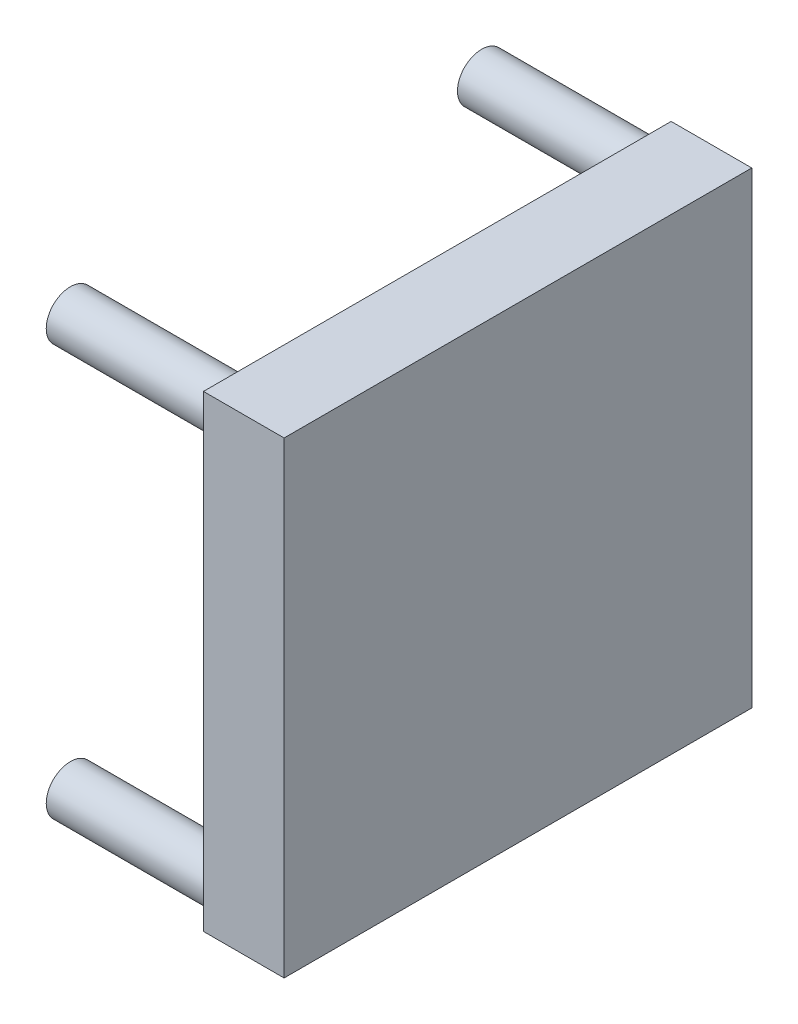
ISO-10303-21;
HEADER;
FILE_DESCRIPTION(('STEP AP214'),'2;1');
FILE_NAME('part.step','',(''),(''),'','','');
FILE_SCHEMA(('AUTOMOTIVE_DESIGN { 1 0 10303 214 1 1 1 1 }'));
ENDSEC;
DATA;
#1=APPLICATION_CONTEXT('core data for automotive mechanical design processes');
#2=APPLICATION_PROTOCOL_DEFINITION('international standard','automotive_design',2000,#1);
#3=PRODUCT_CONTEXT('',#1,'mechanical');
#4=PRODUCT('Part','Part','',(#3));
#5=PRODUCT_RELATED_PRODUCT_CATEGORY('part','',(#4));
#6=PRODUCT_DEFINITION_FORMATION('','',#4);
#7=PRODUCT_DEFINITION_CONTEXT('part definition',#1,'design');
#8=PRODUCT_DEFINITION('design','',#6,#7);
#9=PRODUCT_DEFINITION_SHAPE('','',#8);
#10=(LENGTH_UNIT() NAMED_UNIT(*) SI_UNIT(.MILLI.,.METRE.));
#11=(NAMED_UNIT(*) PLANE_ANGLE_UNIT() SI_UNIT($,.RADIAN.));
#12=(NAMED_UNIT(*) SI_UNIT($,.STERADIAN.) SOLID_ANGLE_UNIT());
#13=UNCERTAINTY_MEASURE_WITH_UNIT(LENGTH_MEASURE(1.E-05),#10,'distance_accuracy_value','');
#14=(GEOMETRIC_REPRESENTATION_CONTEXT(3) GLOBAL_UNCERTAINTY_ASSIGNED_CONTEXT((#13)) GLOBAL_UNIT_ASSIGNED_CONTEXT((#10,
#11,#12)) REPRESENTATION_CONTEXT('',''));
#15=CARTESIAN_POINT('',(0.,0.,0.));
#16=DIRECTION('',(0.,0.,1.));
#17=DIRECTION('',(1.,0.,0.));
#18=AXIS2_PLACEMENT_3D('',#15,#16,#17);
#19=CARTESIAN_POINT('',(5.,-14.5,-14.5));
#20=DIRECTION('',(0.,0.,1.));
#21=DIRECTION('',(1.,0.,0.));
#22=AXIS2_PLACEMENT_3D('',#19,#20,#21);
#23=PLANE('',#22);
#24=DIRECTION('',(0.,1.,0.));
#25=VECTOR('',#24,1.);
#26=CARTESIAN_POINT('',(0.,-14.5,-14.5));
#27=LINE('',#26,#25);
#28=CARTESIAN_POINT('',(0.,-14.5,-14.5));
#29=VERTEX_POINT('',#28);
#30=CARTESIAN_POINT('',(0.,14.5,-14.5));
#31=VERTEX_POINT('',#30);
#32=EDGE_CURVE('E120',#29,#31,#27,.T.);
#33=ORIENTED_EDGE('',*,*,#32,.T.);
#34=DIRECTION('',(-1.,0.,0.));
#35=VECTOR('',#34,1.);
#36=CARTESIAN_POINT('',(5.,14.5,-14.5));
#37=LINE('',#36,#35);
#38=CARTESIAN_POINT('',(5.,14.5,-14.5));
#39=VERTEX_POINT('',#38);
#40=EDGE_CURVE('E48',#39,#31,#37,.T.);
#41=ORIENTED_EDGE('',*,*,#40,.F.);
#42=DIRECTION('',(0.,1.,0.));
#43=VECTOR('',#42,1.);
#44=CARTESIAN_POINT('',(5.,-14.5,-14.5));
#45=LINE('',#44,#43);
#46=CARTESIAN_POINT('',(5.,-14.5,-14.5));
#47=VERTEX_POINT('',#46);
#48=EDGE_CURVE('E99',#47,#39,#45,.T.);
#49=ORIENTED_EDGE('',*,*,#48,.F.);
#50=DIRECTION('',(-1.,0.,0.));
#51=VECTOR('',#50,1.);
#52=CARTESIAN_POINT('',(5.,-14.5,-14.5));
#53=LINE('',#52,#51);
#54=EDGE_CURVE('E114',#47,#29,#53,.T.);
#55=ORIENTED_EDGE('',*,*,#54,.T.);
#56=EDGE_LOOP('',(#33,#41,#49,#55));
#57=FACE_BOUND('',#56,.T.);
#58=ADVANCED_FACE('F44',(#57),#23,.F.);
#59=CARTESIAN_POINT('',(5.,14.5,14.5));
#60=DIRECTION('',(0.,-1.,0.));
#61=DIRECTION('',(0.,0.,-1.));
#62=AXIS2_PLACEMENT_3D('',#59,#60,#61);
#63=PLANE('',#62);
#64=DIRECTION('',(0.,0.,1.));
#65=VECTOR('',#64,1.);
#66=CARTESIAN_POINT('',(0.,14.5,14.5));
#67=LINE('',#66,#65);
#68=CARTESIAN_POINT('',(0.,14.5,14.5));
#69=VERTEX_POINT('',#68);
#70=EDGE_CURVE('E106',#31,#69,#67,.T.);
#71=ORIENTED_EDGE('',*,*,#70,.T.);
#72=DIRECTION('',(-1.,0.,0.));
#73=VECTOR('',#72,1.);
#74=CARTESIAN_POINT('',(5.,14.5,14.5));
#75=LINE('',#74,#73);
#76=CARTESIAN_POINT('',(5.,14.5,14.5));
#77=VERTEX_POINT('',#76);
#78=EDGE_CURVE('E102',#77,#69,#75,.T.);
#79=ORIENTED_EDGE('',*,*,#78,.F.);
#80=DIRECTION('',(0.,0.,1.));
#81=VECTOR('',#80,1.);
#82=CARTESIAN_POINT('',(5.,14.5,14.5));
#83=LINE('',#82,#81);
#84=EDGE_CURVE('E92',#39,#77,#83,.T.);
#85=ORIENTED_EDGE('',*,*,#84,.F.);
#86=ORIENTED_EDGE('',*,*,#40,.T.);
#87=EDGE_LOOP('',(#71,#79,#85,#86));
#88=FACE_BOUND('',#87,.T.);
#89=ADVANCED_FACE('F104',(#88),#63,.F.);
#90=CARTESIAN_POINT('',(5.,-14.5,14.5));
#91=DIRECTION('',(0.,0.,-1.));
#92=DIRECTION('',(-1.,0.,0.));
#93=AXIS2_PLACEMENT_3D('',#90,#91,#92);
#94=PLANE('',#93);
#95=DIRECTION('',(0.,-1.,0.));
#96=VECTOR('',#95,1.);
#97=CARTESIAN_POINT('',(0.,-14.5,14.5));
#98=LINE('',#97,#96);
#99=CARTESIAN_POINT('',(0.,-14.5,14.5));
#100=VERTEX_POINT('',#99);
#101=EDGE_CURVE('E83',#69,#100,#98,.T.);
#102=ORIENTED_EDGE('',*,*,#101,.T.);
#103=DIRECTION('',(-1.,0.,0.));
#104=VECTOR('',#103,1.);
#105=CARTESIAN_POINT('',(5.,-14.5,14.5));
#106=LINE('',#105,#104);
#107=CARTESIAN_POINT('',(5.,-14.5,14.5));
#108=VERTEX_POINT('',#107);
#109=EDGE_CURVE('E107',#108,#100,#106,.T.);
#110=ORIENTED_EDGE('',*,*,#109,.F.);
#111=DIRECTION('',(0.,-1.,0.));
#112=VECTOR('',#111,1.);
#113=CARTESIAN_POINT('',(5.,-14.5,14.5));
#114=LINE('',#113,#112);
#115=EDGE_CURVE('E98',#77,#108,#114,.T.);
#116=ORIENTED_EDGE('',*,*,#115,.F.);
#117=ORIENTED_EDGE('',*,*,#78,.T.);
#118=EDGE_LOOP('',(#102,#110,#116,#117));
#119=FACE_BOUND('',#118,.T.);
#120=ADVANCED_FACE('F108',(#119),#94,.F.);
#121=CARTESIAN_POINT('',(5.,-14.5,14.5));
#122=DIRECTION('',(0.,1.,0.));
#123=DIRECTION('',(0.,0.,1.));
#124=AXIS2_PLACEMENT_3D('',#121,#122,#123);
#125=PLANE('',#124);
#126=DIRECTION('',(0.,0.,-1.));
#127=VECTOR('',#126,1.);
#128=CARTESIAN_POINT('',(0.,-14.5,14.5));
#129=LINE('',#128,#127);
#130=EDGE_CURVE('E87',#100,#29,#129,.T.);
#131=ORIENTED_EDGE('',*,*,#130,.T.);
#132=ORIENTED_EDGE('',*,*,#54,.F.);
#133=DIRECTION('',(0.,0.,-1.));
#134=VECTOR('',#133,1.);
#135=CARTESIAN_POINT('',(5.,-14.5,14.5));
#136=LINE('',#135,#134);
#137=EDGE_CURVE('E61',#108,#47,#136,.T.);
#138=ORIENTED_EDGE('',*,*,#137,.F.);
#139=ORIENTED_EDGE('',*,*,#109,.T.);
#140=EDGE_LOOP('',(#131,#132,#138,#139));
#141=FACE_BOUND('',#140,.T.);
#142=ADVANCED_FACE('F132',(#141),#125,.F.);
#143=CARTESIAN_POINT('',(5.,0.,0.));
#144=DIRECTION('',(-1.,0.,0.));
#145=DIRECTION('',(0.,0.,1.));
#146=AXIS2_PLACEMENT_3D('',#143,#144,#145);
#147=PLANE('',#146);
#148=ORIENTED_EDGE('',*,*,#48,.T.);
#149=ORIENTED_EDGE('',*,*,#84,.T.);
#150=ORIENTED_EDGE('',*,*,#115,.T.);
#151=ORIENTED_EDGE('',*,*,#137,.T.);
#152=EDGE_LOOP('',(#148,#149,#150,#151));
#153=FACE_BOUND('',#152,.T.);
#154=ADVANCED_FACE('F96',(#153),#147,.F.);
#155=CARTESIAN_POINT('',(0.,0.,0.));
#156=DIRECTION('',(-1.,0.,0.));
#157=DIRECTION('',(0.,0.,1.));
#158=AXIS2_PLACEMENT_3D('',#155,#156,#157);
#159=PLANE('',#158);
#160=CARTESIAN_POINT('',(0.,-12.75,-12.75));
#161=DIRECTION('',(-1.,0.,0.));
#162=DIRECTION('',(0.,0.,1.));
#163=AXIS2_PLACEMENT_3D('',#160,#161,#162);
#164=CIRCLE('',#163,1.5);
#165=CARTESIAN_POINT('',(0.,-12.75,-11.25));
#166=VERTEX_POINT('',#165);
#167=EDGE_CURVE('E11',#166,#166,#164,.T.);
#168=ORIENTED_EDGE('',*,*,#167,.F.);
#169=EDGE_LOOP('',(#168));
#170=FACE_BOUND('',#169,.T.);
#171=CARTESIAN_POINT('',(0.,-12.75,12.75));
#172=DIRECTION('',(-1.,0.,0.));
#173=DIRECTION('',(0.,0.,1.));
#174=AXIS2_PLACEMENT_3D('',#171,#172,#173);
#175=CIRCLE('',#174,1.5);
#176=CARTESIAN_POINT('',(0.,-12.75,14.25));
#177=VERTEX_POINT('',#176);
#178=EDGE_CURVE('E54',#177,#177,#175,.T.);
#179=ORIENTED_EDGE('',*,*,#178,.F.);
#180=EDGE_LOOP('',(#179));
#181=FACE_BOUND('',#180,.T.);
#182=CARTESIAN_POINT('',(0.,12.75,12.75));
#183=DIRECTION('',(-1.,0.,0.));
#184=DIRECTION('',(0.,0.,1.));
#185=AXIS2_PLACEMENT_3D('',#182,#183,#184);
#186=CIRCLE('',#185,1.5);
#187=CARTESIAN_POINT('',(0.,12.75,14.25));
#188=VERTEX_POINT('',#187);
#189=EDGE_CURVE('E142',#188,#188,#186,.T.);
#190=ORIENTED_EDGE('',*,*,#189,.F.);
#191=EDGE_LOOP('',(#190));
#192=FACE_BOUND('',#191,.T.);
#193=CARTESIAN_POINT('',(0.,12.75,-12.75));
#194=DIRECTION('',(-1.,0.,0.));
#195=DIRECTION('',(0.,0.,1.));
#196=AXIS2_PLACEMENT_3D('',#193,#194,#195);
#197=CIRCLE('',#196,1.5);
#198=CARTESIAN_POINT('',(0.,12.75,-11.25));
#199=VERTEX_POINT('',#198);
#200=EDGE_CURVE('E136',#199,#199,#197,.T.);
#201=ORIENTED_EDGE('',*,*,#200,.F.);
#202=EDGE_LOOP('',(#201));
#203=FACE_BOUND('',#202,.T.);
#204=ORIENTED_EDGE('',*,*,#32,.F.);
#205=ORIENTED_EDGE('',*,*,#130,.F.);
#206=ORIENTED_EDGE('',*,*,#101,.F.);
#207=ORIENTED_EDGE('',*,*,#70,.F.);
#208=EDGE_LOOP('',(#204,#205,#206,#207));
#209=FACE_BOUND('',#208,.T.);
#210=ADVANCED_FACE('F131',(#170,#181,#192,#203,#209),#159,.T.);
#211=CARTESIAN_POINT('',(-10.,12.75,-12.75));
#212=DIRECTION('',(1.,0.,0.));
#213=DIRECTION('',(0.,0.,-1.));
#214=AXIS2_PLACEMENT_3D('',#211,#212,#213);
#215=CYLINDRICAL_SURFACE('',#214,1.5);
#216=CARTESIAN_POINT('',(-10.,12.75,-12.75));
#217=DIRECTION('',(-1.,0.,0.));
#218=DIRECTION('',(0.,0.,1.));
#219=AXIS2_PLACEMENT_3D('',#216,#217,#218);
#220=CIRCLE('',#219,1.5);
#221=CARTESIAN_POINT('',(-10.,12.75,-11.25));
#222=VERTEX_POINT('',#221);
#223=EDGE_CURVE('E123',#222,#222,#220,.T.);
#224=ORIENTED_EDGE('',*,*,#223,.F.);
#225=EDGE_LOOP('',(#224));
#226=FACE_BOUND('',#225,.T.);
#227=ORIENTED_EDGE('',*,*,#200,.T.);
#228=EDGE_LOOP('',(#227));
#229=FACE_BOUND('',#228,.T.);
#230=ADVANCED_FACE('F166',(#226,#229),#215,.T.);
#231=CARTESIAN_POINT('',(-10.,12.75,-12.75));
#232=DIRECTION('',(-1.,0.,0.));
#233=DIRECTION('',(0.,0.,1.));
#234=AXIS2_PLACEMENT_3D('',#231,#232,#233);
#235=PLANE('',#234);
#236=ORIENTED_EDGE('',*,*,#223,.T.);
#237=EDGE_LOOP('',(#236));
#238=FACE_BOUND('',#237,.T.);
#239=ADVANCED_FACE('F173',(#238),#235,.T.);
#240=CARTESIAN_POINT('',(-10.,12.75,12.75));
#241=DIRECTION('',(1.,0.,0.));
#242=DIRECTION('',(0.,0.,-1.));
#243=AXIS2_PLACEMENT_3D('',#240,#241,#242);
#244=CYLINDRICAL_SURFACE('',#243,1.5);
#245=CARTESIAN_POINT('',(-10.,12.75,12.75));
#246=DIRECTION('',(-1.,0.,0.));
#247=DIRECTION('',(0.,0.,1.));
#248=AXIS2_PLACEMENT_3D('',#245,#246,#247);
#249=CIRCLE('',#248,1.5);
#250=CARTESIAN_POINT('',(-10.,12.75,14.25));
#251=VERTEX_POINT('',#250);
#252=EDGE_CURVE('E148',#251,#251,#249,.T.);
#253=ORIENTED_EDGE('',*,*,#252,.F.);
#254=EDGE_LOOP('',(#253));
#255=FACE_BOUND('',#254,.T.);
#256=ORIENTED_EDGE('',*,*,#189,.T.);
#257=EDGE_LOOP('',(#256));
#258=FACE_BOUND('',#257,.T.);
#259=ADVANCED_FACE('F164',(#255,#258),#244,.T.);
#260=CARTESIAN_POINT('',(-10.,12.75,12.75));
#261=DIRECTION('',(-1.,0.,0.));
#262=DIRECTION('',(0.,0.,1.));
#263=AXIS2_PLACEMENT_3D('',#260,#261,#262);
#264=PLANE('',#263);
#265=ORIENTED_EDGE('',*,*,#252,.T.);
#266=EDGE_LOOP('',(#265));
#267=FACE_BOUND('',#266,.T.);
#268=ADVANCED_FACE('F223',(#267),#264,.T.);
#269=CARTESIAN_POINT('',(-10.,-12.75,12.75));
#270=DIRECTION('',(1.,0.,0.));
#271=DIRECTION('',(0.,0.,-1.));
#272=AXIS2_PLACEMENT_3D('',#269,#270,#271);
#273=CYLINDRICAL_SURFACE('',#272,1.5);
#274=CARTESIAN_POINT('',(-10.,-12.75,12.75));
#275=DIRECTION('',(-1.,0.,0.));
#276=DIRECTION('',(0.,0.,1.));
#277=AXIS2_PLACEMENT_3D('',#274,#275,#276);
#278=CIRCLE('',#277,1.5);
#279=CARTESIAN_POINT('',(-10.,-12.75,14.25));
#280=VERTEX_POINT('',#279);
#281=EDGE_CURVE('E147',#280,#280,#278,.T.);
#282=ORIENTED_EDGE('',*,*,#281,.F.);
#283=EDGE_LOOP('',(#282));
#284=FACE_BOUND('',#283,.T.);
#285=ORIENTED_EDGE('',*,*,#178,.T.);
#286=EDGE_LOOP('',(#285));
#287=FACE_BOUND('',#286,.T.);
#288=ADVANCED_FACE('F234',(#284,#287),#273,.T.);
#289=CARTESIAN_POINT('',(-10.,-12.75,12.75));
#290=DIRECTION('',(-1.,0.,0.));
#291=DIRECTION('',(0.,0.,1.));
#292=AXIS2_PLACEMENT_3D('',#289,#290,#291);
#293=PLANE('',#292);
#294=ORIENTED_EDGE('',*,*,#281,.T.);
#295=EDGE_LOOP('',(#294));
#296=FACE_BOUND('',#295,.T.);
#297=ADVANCED_FACE('F243',(#296),#293,.T.);
#298=CARTESIAN_POINT('',(-10.,-12.75,-12.75));
#299=DIRECTION('',(1.,0.,0.));
#300=DIRECTION('',(0.,0.,-1.));
#301=AXIS2_PLACEMENT_3D('',#298,#299,#300);
#302=CYLINDRICAL_SURFACE('',#301,1.5);
#303=CARTESIAN_POINT('',(-10.,-12.75,-12.75));
#304=DIRECTION('',(-1.,0.,0.));
#305=DIRECTION('',(0.,0.,1.));
#306=AXIS2_PLACEMENT_3D('',#303,#304,#305);
#307=CIRCLE('',#306,1.5);
#308=CARTESIAN_POINT('',(-10.,-12.75,-11.25));
#309=VERTEX_POINT('',#308);
#310=EDGE_CURVE('E150',#309,#309,#307,.T.);
#311=ORIENTED_EDGE('',*,*,#310,.F.);
#312=EDGE_LOOP('',(#311));
#313=FACE_BOUND('',#312,.T.);
#314=ORIENTED_EDGE('',*,*,#167,.T.);
#315=EDGE_LOOP('',(#314));
#316=FACE_BOUND('',#315,.T.);
#317=ADVANCED_FACE('F254',(#313,#316),#302,.T.);
#318=CARTESIAN_POINT('',(-10.,-12.75,-12.75));
#319=DIRECTION('',(-1.,0.,0.));
#320=DIRECTION('',(0.,0.,1.));
#321=AXIS2_PLACEMENT_3D('',#318,#319,#320);
#322=PLANE('',#321);
#323=ORIENTED_EDGE('',*,*,#310,.T.);
#324=EDGE_LOOP('',(#323));
#325=FACE_BOUND('',#324,.T.);
#326=ADVANCED_FACE('F264',(#325),#322,.T.);
#327=CLOSED_SHELL('',(#58,#89,#120,#142,#154,#210,#230,#239,#259,#268,#288,#297,#317,#326));
#328=MANIFOLD_SOLID_BREP('B2',#327);
#329=ADVANCED_BREP_SHAPE_REPRESENTATION('',(#18,#328),#14);
#330=SHAPE_DEFINITION_REPRESENTATION(#9,#329);
ENDSEC;
END-ISO-10303-21;
